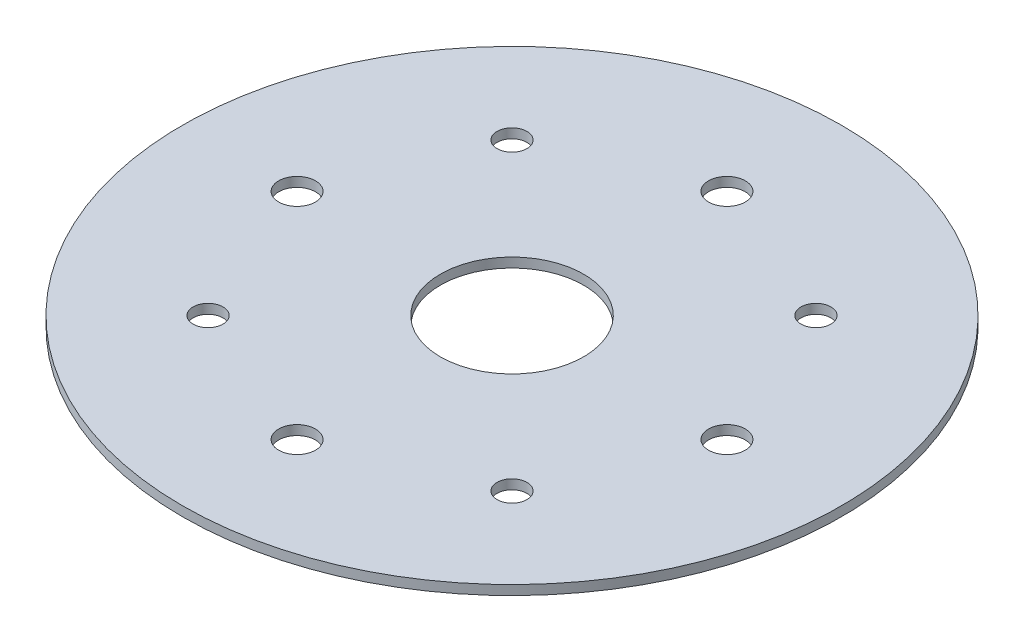
ISO-10303-21;
HEADER;
FILE_DESCRIPTION(('STEP AP214'),'2;1');
FILE_NAME('part.step','',(''),(''),'','','');
FILE_SCHEMA(('AUTOMOTIVE_DESIGN { 1 0 10303 214 1 1 1 1 }'));
ENDSEC;
DATA;
#1=APPLICATION_CONTEXT('core data for automotive mechanical design processes');
#2=APPLICATION_PROTOCOL_DEFINITION('international standard','automotive_design',2000,#1);
#3=PRODUCT_CONTEXT('',#1,'mechanical');
#4=PRODUCT('Part','Part','',(#3));
#5=PRODUCT_RELATED_PRODUCT_CATEGORY('part','',(#4));
#6=PRODUCT_DEFINITION_FORMATION('','',#4);
#7=PRODUCT_DEFINITION_CONTEXT('part definition',#1,'design');
#8=PRODUCT_DEFINITION('design','',#6,#7);
#9=PRODUCT_DEFINITION_SHAPE('','',#8);
#10=(LENGTH_UNIT() NAMED_UNIT(*) SI_UNIT(.MILLI.,.METRE.));
#11=(NAMED_UNIT(*) PLANE_ANGLE_UNIT() SI_UNIT($,.RADIAN.));
#12=(NAMED_UNIT(*) SI_UNIT($,.STERADIAN.) SOLID_ANGLE_UNIT());
#13=UNCERTAINTY_MEASURE_WITH_UNIT(LENGTH_MEASURE(1.E-05),#10,'distance_accuracy_value','');
#14=(GEOMETRIC_REPRESENTATION_CONTEXT(3) GLOBAL_UNCERTAINTY_ASSIGNED_CONTEXT((#13)) GLOBAL_UNIT_ASSIGNED_CONTEXT((#10,
#11,#12)) REPRESENTATION_CONTEXT('',''));
#15=CARTESIAN_POINT('',(0.,0.,0.));
#16=DIRECTION('',(0.,0.,1.));
#17=DIRECTION('',(1.,0.,0.));
#18=AXIS2_PLACEMENT_3D('',#15,#16,#17);
#19=CARTESIAN_POINT('',(0.,1.,-22.5));
#20=DIRECTION('',(0.,-1.,0.));
#21=DIRECTION('',(0.,0.,-1.));
#22=AXIS2_PLACEMENT_3D('',#19,#20,#21);
#23=CYLINDRICAL_SURFACE('',#22,1.925);
#24=CARTESIAN_POINT('',(0.,1.,-22.5));
#25=DIRECTION('',(0.,1.,0.));
#26=DIRECTION('',(0.,0.,1.));
#27=AXIS2_PLACEMENT_3D('',#24,#25,#26);
#28=CIRCLE('',#27,1.925);
#29=CARTESIAN_POINT('',(0.,1.,-20.575));
#30=VERTEX_POINT('',#29);
#31=EDGE_CURVE('E54',#30,#30,#28,.T.);
#32=ORIENTED_EDGE('',*,*,#31,.T.);
#33=EDGE_LOOP('',(#32));
#34=FACE_BOUND('',#33,.T.);
#35=CARTESIAN_POINT('',(0.,0.,-22.5));
#36=DIRECTION('',(0.,1.,0.));
#37=DIRECTION('',(0.,0.,1.));
#38=AXIS2_PLACEMENT_3D('',#35,#36,#37);
#39=CIRCLE('',#38,1.925);
#40=CARTESIAN_POINT('',(0.,0.,-20.575));
#41=VERTEX_POINT('',#40);
#42=EDGE_CURVE('E96',#41,#41,#39,.T.);
#43=ORIENTED_EDGE('',*,*,#42,.F.);
#44=EDGE_LOOP('',(#43));
#45=FACE_BOUND('',#44,.T.);
#46=ADVANCED_FACE('F45',(#34,#45),#23,.F.);
#47=CARTESIAN_POINT('',(-22.5,1.,0.));
#48=DIRECTION('',(0.,-1.,0.));
#49=DIRECTION('',(0.,0.,-1.));
#50=AXIS2_PLACEMENT_3D('',#47,#48,#49);
#51=CYLINDRICAL_SURFACE('',#50,1.925);
#52=CARTESIAN_POINT('',(-22.5,1.,0.));
#53=DIRECTION('',(0.,1.,0.));
#54=DIRECTION('',(0.,0.,1.));
#55=AXIS2_PLACEMENT_3D('',#52,#53,#54);
#56=CIRCLE('',#55,1.925);
#57=CARTESIAN_POINT('',(-22.5,1.,1.925));
#58=VERTEX_POINT('',#57);
#59=EDGE_CURVE('E63',#58,#58,#56,.T.);
#60=ORIENTED_EDGE('',*,*,#59,.T.);
#61=EDGE_LOOP('',(#60));
#62=FACE_BOUND('',#61,.T.);
#63=CARTESIAN_POINT('',(-22.5,0.,0.));
#64=DIRECTION('',(0.,1.,0.));
#65=DIRECTION('',(0.,0.,1.));
#66=AXIS2_PLACEMENT_3D('',#63,#64,#65);
#67=CIRCLE('',#66,1.925);
#68=CARTESIAN_POINT('',(-22.5,0.,1.925));
#69=VERTEX_POINT('',#68);
#70=EDGE_CURVE('E93',#69,#69,#67,.T.);
#71=ORIENTED_EDGE('',*,*,#70,.F.);
#72=EDGE_LOOP('',(#71));
#73=FACE_BOUND('',#72,.T.);
#74=ADVANCED_FACE('F143',(#62,#73),#51,.F.);
#75=CARTESIAN_POINT('',(0.,1.,22.5));
#76=DIRECTION('',(0.,-1.,0.));
#77=DIRECTION('',(0.,0.,-1.));
#78=AXIS2_PLACEMENT_3D('',#75,#76,#77);
#79=CYLINDRICAL_SURFACE('',#78,1.925);
#80=CARTESIAN_POINT('',(0.,1.,22.5));
#81=DIRECTION('',(0.,1.,0.));
#82=DIRECTION('',(0.,0.,1.));
#83=AXIS2_PLACEMENT_3D('',#80,#81,#82);
#84=CIRCLE('',#83,1.925);
#85=CARTESIAN_POINT('',(0.,1.,24.425));
#86=VERTEX_POINT('',#85);
#87=EDGE_CURVE('E135',#86,#86,#84,.T.);
#88=ORIENTED_EDGE('',*,*,#87,.T.);
#89=EDGE_LOOP('',(#88));
#90=FACE_BOUND('',#89,.T.);
#91=CARTESIAN_POINT('',(0.,0.,22.5));
#92=DIRECTION('',(0.,1.,0.));
#93=DIRECTION('',(0.,0.,1.));
#94=AXIS2_PLACEMENT_3D('',#91,#92,#93);
#95=CIRCLE('',#94,1.925);
#96=CARTESIAN_POINT('',(0.,0.,24.425));
#97=VERTEX_POINT('',#96);
#98=EDGE_CURVE('E89',#97,#97,#95,.T.);
#99=ORIENTED_EDGE('',*,*,#98,.F.);
#100=EDGE_LOOP('',(#99));
#101=FACE_BOUND('',#100,.T.);
#102=ADVANCED_FACE('F161',(#90,#101),#79,.F.);
#103=CARTESIAN_POINT('',(22.5,1.,0.));
#104=DIRECTION('',(0.,-1.,0.));
#105=DIRECTION('',(0.,0.,-1.));
#106=AXIS2_PLACEMENT_3D('',#103,#104,#105);
#107=CYLINDRICAL_SURFACE('',#106,1.925);
#108=CARTESIAN_POINT('',(22.5,1.,0.));
#109=DIRECTION('',(0.,1.,0.));
#110=DIRECTION('',(0.,0.,1.));
#111=AXIS2_PLACEMENT_3D('',#108,#109,#110);
#112=CIRCLE('',#111,1.925);
#113=CARTESIAN_POINT('',(22.5,1.,1.925));
#114=VERTEX_POINT('',#113);
#115=EDGE_CURVE('E132',#114,#114,#112,.T.);
#116=ORIENTED_EDGE('',*,*,#115,.T.);
#117=EDGE_LOOP('',(#116));
#118=FACE_BOUND('',#117,.T.);
#119=CARTESIAN_POINT('',(22.5,0.,0.));
#120=DIRECTION('',(0.,1.,0.));
#121=DIRECTION('',(0.,0.,1.));
#122=AXIS2_PLACEMENT_3D('',#119,#120,#121);
#123=CIRCLE('',#122,1.925);
#124=CARTESIAN_POINT('',(22.5,0.,1.925));
#125=VERTEX_POINT('',#124);
#126=EDGE_CURVE('E85',#125,#125,#123,.T.);
#127=ORIENTED_EDGE('',*,*,#126,.F.);
#128=EDGE_LOOP('',(#127));
#129=FACE_BOUND('',#128,.T.);
#130=ADVANCED_FACE('F168',(#118,#129),#107,.F.);
#131=CARTESIAN_POINT('',(15.9099025767,1.,-15.9099025767));
#132=DIRECTION('',(0.,-1.,0.));
#133=DIRECTION('',(0.,0.,-1.));
#134=AXIS2_PLACEMENT_3D('',#131,#132,#133);
#135=CYLINDRICAL_SURFACE('',#134,1.5635);
#136=CARTESIAN_POINT('',(15.9099025767,1.,-15.9099025767));
#137=DIRECTION('',(0.,1.,0.));
#138=DIRECTION('',(0.,0.,1.));
#139=AXIS2_PLACEMENT_3D('',#136,#137,#138);
#140=CIRCLE('',#139,1.5635);
#141=CARTESIAN_POINT('',(15.9099025767,1.,-14.3464025767));
#142=VERTEX_POINT('',#141);
#143=EDGE_CURVE('E128',#142,#142,#140,.T.);
#144=ORIENTED_EDGE('',*,*,#143,.T.);
#145=EDGE_LOOP('',(#144));
#146=FACE_BOUND('',#145,.T.);
#147=CARTESIAN_POINT('',(15.9099025767,0.,-15.9099025767));
#148=DIRECTION('',(0.,1.,0.));
#149=DIRECTION('',(0.,0.,1.));
#150=AXIS2_PLACEMENT_3D('',#147,#148,#149);
#151=CIRCLE('',#150,1.5635);
#152=CARTESIAN_POINT('',(15.9099025767,0.,-14.3464025767));
#153=VERTEX_POINT('',#152);
#154=EDGE_CURVE('E81',#153,#153,#151,.T.);
#155=ORIENTED_EDGE('',*,*,#154,.F.);
#156=EDGE_LOOP('',(#155));
#157=FACE_BOUND('',#156,.T.);
#158=ADVANCED_FACE('F172',(#146,#157),#135,.F.);
#159=CARTESIAN_POINT('',(-15.9099025767,1.,-15.9099025767));
#160=DIRECTION('',(0.,-1.,0.));
#161=DIRECTION('',(0.,0.,-1.));
#162=AXIS2_PLACEMENT_3D('',#159,#160,#161);
#163=CYLINDRICAL_SURFACE('',#162,1.5635);
#164=CARTESIAN_POINT('',(-15.9099025767,1.,-15.9099025767));
#165=DIRECTION('',(0.,1.,0.));
#166=DIRECTION('',(0.,0.,1.));
#167=AXIS2_PLACEMENT_3D('',#164,#165,#166);
#168=CIRCLE('',#167,1.5635);
#169=CARTESIAN_POINT('',(-15.9099025767,1.,-14.3464025767));
#170=VERTEX_POINT('',#169);
#171=EDGE_CURVE('E124',#170,#170,#168,.T.);
#172=ORIENTED_EDGE('',*,*,#171,.T.);
#173=EDGE_LOOP('',(#172));
#174=FACE_BOUND('',#173,.T.);
#175=CARTESIAN_POINT('',(-15.9099025767,0.,-15.9099025767));
#176=DIRECTION('',(0.,1.,0.));
#177=DIRECTION('',(0.,0.,1.));
#178=AXIS2_PLACEMENT_3D('',#175,#176,#177);
#179=CIRCLE('',#178,1.5635);
#180=CARTESIAN_POINT('',(-15.9099025767,0.,-14.3464025767));
#181=VERTEX_POINT('',#180);
#182=EDGE_CURVE('E77',#181,#181,#179,.T.);
#183=ORIENTED_EDGE('',*,*,#182,.F.);
#184=EDGE_LOOP('',(#183));
#185=FACE_BOUND('',#184,.T.);
#186=ADVANCED_FACE('F176',(#174,#185),#163,.F.);
#187=CARTESIAN_POINT('',(-15.9099025767,1.,15.9099025767));
#188=DIRECTION('',(0.,-1.,0.));
#189=DIRECTION('',(0.,0.,-1.));
#190=AXIS2_PLACEMENT_3D('',#187,#188,#189);
#191=CYLINDRICAL_SURFACE('',#190,1.5635);
#192=CARTESIAN_POINT('',(-15.9099025767,1.,15.9099025767));
#193=DIRECTION('',(0.,1.,0.));
#194=DIRECTION('',(0.,0.,1.));
#195=AXIS2_PLACEMENT_3D('',#192,#193,#194);
#196=CIRCLE('',#195,1.5635);
#197=CARTESIAN_POINT('',(-15.9099025767,1.,17.4734025767));
#198=VERTEX_POINT('',#197);
#199=EDGE_CURVE('E119',#198,#198,#196,.T.);
#200=ORIENTED_EDGE('',*,*,#199,.T.);
#201=EDGE_LOOP('',(#200));
#202=FACE_BOUND('',#201,.T.);
#203=CARTESIAN_POINT('',(-15.9099025767,0.,15.9099025767));
#204=DIRECTION('',(0.,1.,0.));
#205=DIRECTION('',(0.,0.,1.));
#206=AXIS2_PLACEMENT_3D('',#203,#204,#205);
#207=CIRCLE('',#206,1.5635);
#208=CARTESIAN_POINT('',(-15.9099025767,0.,17.4734025767));
#209=VERTEX_POINT('',#208);
#210=EDGE_CURVE('E73',#209,#209,#207,.T.);
#211=ORIENTED_EDGE('',*,*,#210,.F.);
#212=EDGE_LOOP('',(#211));
#213=FACE_BOUND('',#212,.T.);
#214=ADVANCED_FACE('F180',(#202,#213),#191,.F.);
#215=CARTESIAN_POINT('',(15.9099025767,1.,15.9099025767));
#216=DIRECTION('',(0.,-1.,0.));
#217=DIRECTION('',(0.,0.,-1.));
#218=AXIS2_PLACEMENT_3D('',#215,#216,#217);
#219=CYLINDRICAL_SURFACE('',#218,1.5635);
#220=CARTESIAN_POINT('',(15.9099025767,1.,15.9099025767));
#221=DIRECTION('',(0.,1.,0.));
#222=DIRECTION('',(0.,0.,1.));
#223=AXIS2_PLACEMENT_3D('',#220,#221,#222);
#224=CIRCLE('',#223,1.5635);
#225=CARTESIAN_POINT('',(15.9099025767,1.,17.4734025767));
#226=VERTEX_POINT('',#225);
#227=EDGE_CURVE('E112',#226,#226,#224,.T.);
#228=ORIENTED_EDGE('',*,*,#227,.T.);
#229=EDGE_LOOP('',(#228));
#230=FACE_BOUND('',#229,.T.);
#231=CARTESIAN_POINT('',(15.9099025767,0.,15.9099025767));
#232=DIRECTION('',(0.,1.,0.));
#233=DIRECTION('',(0.,0.,1.));
#234=AXIS2_PLACEMENT_3D('',#231,#232,#233);
#235=CIRCLE('',#234,1.5635);
#236=CARTESIAN_POINT('',(15.9099025767,0.,17.4734025767));
#237=VERTEX_POINT('',#236);
#238=EDGE_CURVE('E70',#237,#237,#235,.T.);
#239=ORIENTED_EDGE('',*,*,#238,.F.);
#240=EDGE_LOOP('',(#239));
#241=FACE_BOUND('',#240,.T.);
#242=ADVANCED_FACE('F183',(#230,#241),#219,.F.);
#243=CARTESIAN_POINT('',(0.,1.,0.));
#244=DIRECTION('',(0.,-1.,0.));
#245=DIRECTION('',(0.,0.,-1.));
#246=AXIS2_PLACEMENT_3D('',#243,#244,#245);
#247=CYLINDRICAL_SURFACE('',#246,7.5);
#248=CARTESIAN_POINT('',(0.,1.,0.));
#249=DIRECTION('',(0.,1.,0.));
#250=DIRECTION('',(0.,0.,1.));
#251=AXIS2_PLACEMENT_3D('',#248,#249,#250);
#252=CIRCLE('',#251,7.5);
#253=CARTESIAN_POINT('',(0.,1.,7.5));
#254=VERTEX_POINT('',#253);
#255=EDGE_CURVE('E105',#254,#254,#252,.T.);
#256=ORIENTED_EDGE('',*,*,#255,.T.);
#257=EDGE_LOOP('',(#256));
#258=FACE_BOUND('',#257,.T.);
#259=CARTESIAN_POINT('',(0.,0.,0.));
#260=DIRECTION('',(0.,1.,0.));
#261=DIRECTION('',(0.,0.,1.));
#262=AXIS2_PLACEMENT_3D('',#259,#260,#261);
#263=CIRCLE('',#262,7.5);
#264=CARTESIAN_POINT('',(0.,0.,7.5));
#265=VERTEX_POINT('',#264);
#266=EDGE_CURVE('E67',#265,#265,#263,.T.);
#267=ORIENTED_EDGE('',*,*,#266,.F.);
#268=EDGE_LOOP('',(#267));
#269=FACE_BOUND('',#268,.T.);
#270=ADVANCED_FACE('F47',(#258,#269),#247,.F.);
#271=CARTESIAN_POINT('',(0.,1.,0.));
#272=DIRECTION('',(0.,-1.,0.));
#273=DIRECTION('',(0.,0.,-1.));
#274=AXIS2_PLACEMENT_3D('',#271,#272,#273);
#275=CYLINDRICAL_SURFACE('',#274,34.5);
#276=CARTESIAN_POINT('',(0.,1.,0.));
#277=DIRECTION('',(0.,1.,0.));
#278=DIRECTION('',(0.,0.,1.));
#279=AXIS2_PLACEMENT_3D('',#276,#277,#278);
#280=CIRCLE('',#279,34.5);
#281=CARTESIAN_POINT('',(0.,1.,34.5));
#282=VERTEX_POINT('',#281);
#283=EDGE_CURVE('E10',#282,#282,#280,.T.);
#284=ORIENTED_EDGE('',*,*,#283,.F.);
#285=EDGE_LOOP('',(#284));
#286=FACE_BOUND('',#285,.T.);
#287=CARTESIAN_POINT('',(0.,0.,0.));
#288=DIRECTION('',(0.,1.,0.));
#289=DIRECTION('',(0.,0.,1.));
#290=AXIS2_PLACEMENT_3D('',#287,#288,#289);
#291=CIRCLE('',#290,34.5);
#292=CARTESIAN_POINT('',(0.,0.,34.5));
#293=VERTEX_POINT('',#292);
#294=EDGE_CURVE('E49',#293,#293,#291,.T.);
#295=ORIENTED_EDGE('',*,*,#294,.T.);
#296=EDGE_LOOP('',(#295));
#297=FACE_BOUND('',#296,.T.);
#298=ADVANCED_FACE('F150',(#286,#297),#275,.T.);
#299=CARTESIAN_POINT('',(0.,1.,0.));
#300=DIRECTION('',(0.,1.,0.));
#301=DIRECTION('',(0.,0.,1.));
#302=AXIS2_PLACEMENT_3D('',#299,#300,#301);
#303=PLANE('',#302);
#304=ORIENTED_EDGE('',*,*,#255,.F.);
#305=EDGE_LOOP('',(#304));
#306=FACE_BOUND('',#305,.T.);
#307=ORIENTED_EDGE('',*,*,#227,.F.);
#308=EDGE_LOOP('',(#307));
#309=FACE_BOUND('',#308,.T.);
#310=ORIENTED_EDGE('',*,*,#199,.F.);
#311=EDGE_LOOP('',(#310));
#312=FACE_BOUND('',#311,.T.);
#313=ORIENTED_EDGE('',*,*,#171,.F.);
#314=EDGE_LOOP('',(#313));
#315=FACE_BOUND('',#314,.T.);
#316=ORIENTED_EDGE('',*,*,#143,.F.);
#317=EDGE_LOOP('',(#316));
#318=FACE_BOUND('',#317,.T.);
#319=ORIENTED_EDGE('',*,*,#115,.F.);
#320=EDGE_LOOP('',(#319));
#321=FACE_BOUND('',#320,.T.);
#322=ORIENTED_EDGE('',*,*,#87,.F.);
#323=EDGE_LOOP('',(#322));
#324=FACE_BOUND('',#323,.T.);
#325=ORIENTED_EDGE('',*,*,#59,.F.);
#326=EDGE_LOOP('',(#325));
#327=FACE_BOUND('',#326,.T.);
#328=ORIENTED_EDGE('',*,*,#31,.F.);
#329=EDGE_LOOP('',(#328));
#330=FACE_BOUND('',#329,.T.);
#331=ORIENTED_EDGE('',*,*,#283,.T.);
#332=EDGE_LOOP('',(#331));
#333=FACE_BOUND('',#332,.T.);
#334=ADVANCED_FACE('F146',(#306,#309,#312,#315,#318,#321,#324,#327,#330,#333),#303,.T.);
#335=CARTESIAN_POINT('',(0.,0.,0.));
#336=DIRECTION('',(0.,1.,0.));
#337=DIRECTION('',(0.,0.,1.));
#338=AXIS2_PLACEMENT_3D('',#335,#336,#337);
#339=PLANE('',#338);
#340=ORIENTED_EDGE('',*,*,#266,.T.);
#341=EDGE_LOOP('',(#340));
#342=FACE_BOUND('',#341,.T.);
#343=ORIENTED_EDGE('',*,*,#238,.T.);
#344=EDGE_LOOP('',(#343));
#345=FACE_BOUND('',#344,.T.);
#346=ORIENTED_EDGE('',*,*,#210,.T.);
#347=EDGE_LOOP('',(#346));
#348=FACE_BOUND('',#347,.T.);
#349=ORIENTED_EDGE('',*,*,#182,.T.);
#350=EDGE_LOOP('',(#349));
#351=FACE_BOUND('',#350,.T.);
#352=ORIENTED_EDGE('',*,*,#154,.T.);
#353=EDGE_LOOP('',(#352));
#354=FACE_BOUND('',#353,.T.);
#355=ORIENTED_EDGE('',*,*,#126,.T.);
#356=EDGE_LOOP('',(#355));
#357=FACE_BOUND('',#356,.T.);
#358=ORIENTED_EDGE('',*,*,#98,.T.);
#359=EDGE_LOOP('',(#358));
#360=FACE_BOUND('',#359,.T.);
#361=ORIENTED_EDGE('',*,*,#70,.T.);
#362=EDGE_LOOP('',(#361));
#363=FACE_BOUND('',#362,.T.);
#364=ORIENTED_EDGE('',*,*,#42,.T.);
#365=EDGE_LOOP('',(#364));
#366=FACE_BOUND('',#365,.T.);
#367=ORIENTED_EDGE('',*,*,#294,.F.);
#368=EDGE_LOOP('',(#367));
#369=FACE_BOUND('',#368,.T.);
#370=ADVANCED_FACE('F149',(#342,#345,#348,#351,#354,#357,#360,#363,#366,#369),#339,.F.);
#371=CLOSED_SHELL('',(#46,#74,#102,#130,#158,#186,#214,#242,#270,#298,#334,#370));
#372=MANIFOLD_SOLID_BREP('B2',#371);
#373=ADVANCED_BREP_SHAPE_REPRESENTATION('',(#18,#372),#14);
#374=SHAPE_DEFINITION_REPRESENTATION(#9,#373);
ENDSEC;
END-ISO-10303-21;
